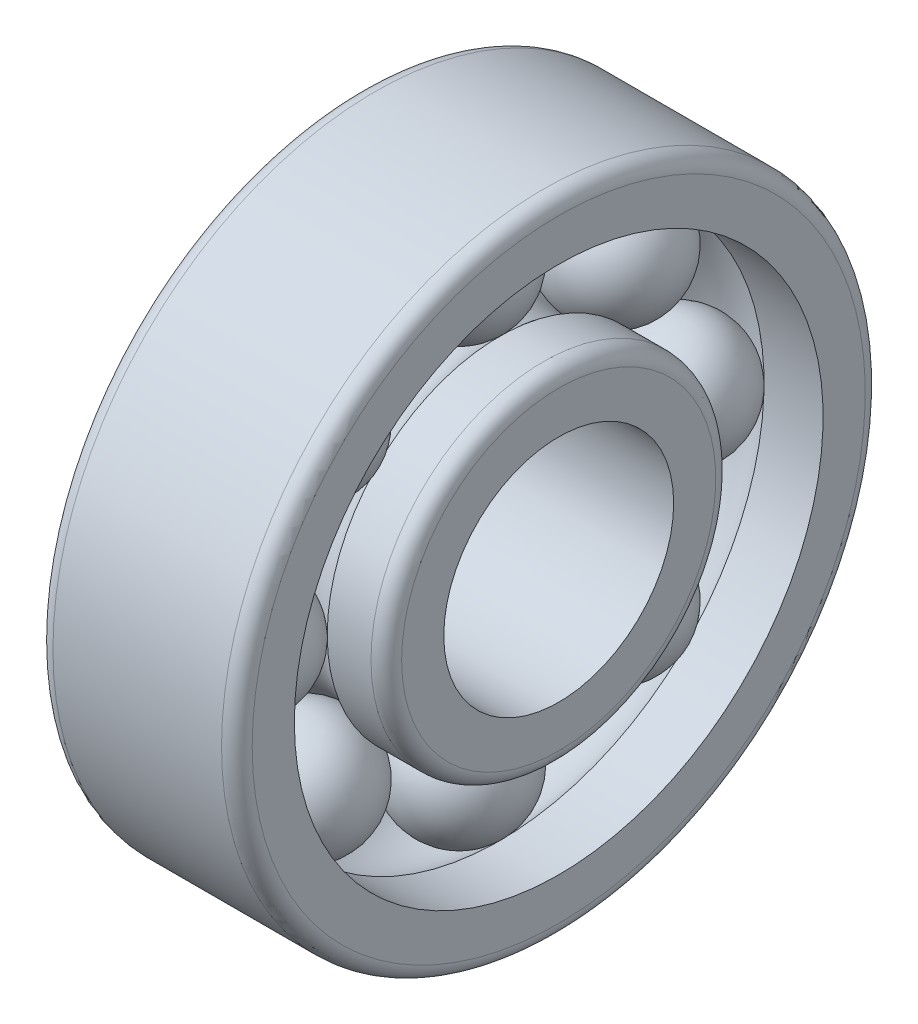
ISO-10303-21;
HEADER;
FILE_DESCRIPTION(('STEP AP214'),'2;1');
FILE_NAME('part.step','',(''),(''),'','','');
FILE_SCHEMA(('AUTOMOTIVE_DESIGN { 1 0 10303 214 1 1 1 1 }'));
ENDSEC;
DATA;
#1=APPLICATION_CONTEXT('core data for automotive mechanical design processes');
#2=APPLICATION_PROTOCOL_DEFINITION('international standard','automotive_design',2000,#1);
#3=PRODUCT_CONTEXT('',#1,'mechanical');
#4=PRODUCT('Part','Part','',(#3));
#5=PRODUCT_RELATED_PRODUCT_CATEGORY('part','',(#4));
#6=PRODUCT_DEFINITION_FORMATION('','',#4);
#7=PRODUCT_DEFINITION_CONTEXT('part definition',#1,'design');
#8=PRODUCT_DEFINITION('design','',#6,#7);
#9=PRODUCT_DEFINITION_SHAPE('','',#8);
#10=(LENGTH_UNIT() NAMED_UNIT(*) SI_UNIT(.MILLI.,.METRE.));
#11=(NAMED_UNIT(*) PLANE_ANGLE_UNIT() SI_UNIT($,.RADIAN.));
#12=(NAMED_UNIT(*) SI_UNIT($,.STERADIAN.) SOLID_ANGLE_UNIT());
#13=UNCERTAINTY_MEASURE_WITH_UNIT(LENGTH_MEASURE(1.E-05),#10,'distance_accuracy_value','');
#14=(GEOMETRIC_REPRESENTATION_CONTEXT(3) GLOBAL_UNCERTAINTY_ASSIGNED_CONTEXT((#13)) GLOBAL_UNIT_ASSIGNED_CONTEXT((#10,
#11,#12)) REPRESENTATION_CONTEXT('',''));
#15=CARTESIAN_POINT('',(0.,0.,0.));
#16=DIRECTION('',(0.,0.,1.));
#17=DIRECTION('',(1.,0.,0.));
#18=AXIS2_PLACEMENT_3D('',#15,#16,#17);
#19=CARTESIAN_POINT('',(0.,10.0762716319084,10.0762716319082));
#20=DIRECTION('',(0.,0.707106781186556,0.707106781186539));
#21=DIRECTION('',(0.,0.707106781186539,-0.707106781186556));
#22=AXIS2_PLACEMENT_3D('',#19,#20,#21);
#23=SPHERICAL_SURFACE('',#22,4.);
#24=CARTESIAN_POINT('',(0.,12.9046987566546,12.9046987566543));
#25=VERTEX_POINT('',#24);
#26=VERTEX_LOOP('',#25);
#27=FACE_BOUND('',#26,.T.);
#28=ADVANCED_FACE('F44',(#27),#23,.T.);
#29=CLOSED_SHELL('',(#28));
#30=MANIFOLD_SOLID_BREP('B2',#29);
#31=CARTESIAN_POINT('',(0.,1.49260827235544E-13,14.25));
#32=DIRECTION('',(0.,0.,1.));
#33=DIRECTION('',(0.,1.,0.));
#34=AXIS2_PLACEMENT_3D('',#31,#32,#33);
#35=SPHERICAL_SURFACE('',#34,4.);
#36=CARTESIAN_POINT('',(0.,1.91158603301662E-13,18.25));
#37=VERTEX_POINT('',#36);
#38=VERTEX_LOOP('',#37);
#39=FACE_BOUND('',#38,.T.);
#40=ADVANCED_FACE('F63',(#39),#35,.T.);
#41=CLOSED_SHELL('',(#40));
#42=MANIFOLD_SOLID_BREP('B6',#41);
#43=CARTESIAN_POINT('',(0.,-10.0762716319082,10.0762716319084));
#44=DIRECTION('',(0.,-0.707106781186541,0.707106781186554));
#45=DIRECTION('',(0.,0.707106781186554,0.707106781186541));
#46=AXIS2_PLACEMENT_3D('',#43,#44,#45);
#47=SPHERICAL_SURFACE('',#46,4.);
#48=CARTESIAN_POINT('',(0.,-12.9046987566544,12.9046987566546));
#49=VERTEX_POINT('',#48);
#50=VERTEX_LOOP('',#49);
#51=FACE_BOUND('',#50,.T.);
#52=ADVANCED_FACE('F82',(#51),#47,.T.);
#53=CLOSED_SHELL('',(#52));
#54=MANIFOLD_SOLID_BREP('B40',#53);
#55=CARTESIAN_POINT('',(0.,-14.25,0.));
#56=DIRECTION('',(0.,-1.,0.));
#57=DIRECTION('',(0.,0.,1.));
#58=AXIS2_PLACEMENT_3D('',#55,#56,#57);
#59=SPHERICAL_SURFACE('',#58,4.);
#60=CARTESIAN_POINT('',(0.,-18.25,0.));
#61=VERTEX_POINT('',#60);
#62=VERTEX_LOOP('',#61);
#63=FACE_BOUND('',#62,.T.);
#64=ADVANCED_FACE('F101',(#63),#59,.T.);
#65=CLOSED_SHELL('',(#64));
#66=MANIFOLD_SOLID_BREP('B59',#65);
#67=CARTESIAN_POINT('',(0.,-10.0762716319084,-10.0762716319082));
#68=DIRECTION('',(0.,-0.707106781186551,-0.707106781186544));
#69=DIRECTION('',(0.,-0.707106781186544,0.707106781186551));
#70=AXIS2_PLACEMENT_3D('',#67,#68,#69);
#71=SPHERICAL_SURFACE('',#70,4.);
#72=CARTESIAN_POINT('',(0.,-12.9046987566546,-12.9046987566544));
#73=VERTEX_POINT('',#72);
#74=VERTEX_LOOP('',#73);
#75=FACE_BOUND('',#74,.T.);
#76=ADVANCED_FACE('F120',(#75),#71,.T.);
#77=CLOSED_SHELL('',(#76));
#78=MANIFOLD_SOLID_BREP('B78',#77);
#79=CARTESIAN_POINT('',(0.,0.,-14.25));
#80=DIRECTION('',(0.,0.,-1.));
#81=DIRECTION('',(0.,-1.,0.));
#82=AXIS2_PLACEMENT_3D('',#79,#80,#81);
#83=SPHERICAL_SURFACE('',#82,4.);
#84=CARTESIAN_POINT('',(0.,0.,-18.25));
#85=VERTEX_POINT('',#84);
#86=VERTEX_LOOP('',#85);
#87=FACE_BOUND('',#86,.T.);
#88=ADVANCED_FACE('F139',(#87),#83,.T.);
#89=CLOSED_SHELL('',(#88));
#90=MANIFOLD_SOLID_BREP('B97',#89);
#91=CARTESIAN_POINT('',(0.,10.0762716319083,-10.0762716319083));
#92=DIRECTION('',(0.,0.707106781186546,-0.707106781186549));
#93=DIRECTION('',(0.,-0.707106781186549,-0.707106781186546));
#94=AXIS2_PLACEMENT_3D('',#91,#92,#93);
#95=SPHERICAL_SURFACE('',#94,4.);
#96=CARTESIAN_POINT('',(0.,12.9046987566545,-12.9046987566545));
#97=VERTEX_POINT('',#96);
#98=VERTEX_LOOP('',#97);
#99=FACE_BOUND('',#98,.T.);
#100=ADVANCED_FACE('F158',(#99),#95,.T.);
#101=CLOSED_SHELL('',(#100));
#102=MANIFOLD_SOLID_BREP('B116',#101);
#103=CARTESIAN_POINT('',(0.,14.25,0.));
#104=DIRECTION('',(0.,1.,0.));
#105=DIRECTION('',(0.,0.,-1.));
#106=AXIS2_PLACEMENT_3D('',#103,#104,#105);
#107=SPHERICAL_SURFACE('',#106,4.);
#108=CARTESIAN_POINT('',(0.,18.25,0.));
#109=VERTEX_POINT('',#108);
#110=VERTEX_LOOP('',#109);
#111=FACE_BOUND('',#110,.T.);
#112=ADVANCED_FACE('F179',(#111),#107,.T.);
#113=CLOSED_SHELL('',(#112));
#114=MANIFOLD_SOLID_BREP('B135',#113);
#115=CARTESIAN_POINT('',(0.,0.,0.));
#116=DIRECTION('',(-1.,0.,0.));
#117=DIRECTION('',(0.,0.,1.));
#118=AXIS2_PLACEMENT_3D('',#115,#116,#117);
#119=TOROIDAL_SURFACE('',#118,14.25,4.);
#120=CARTESIAN_POINT('',(2.64575131106459,0.,0.));
#121=DIRECTION('',(-1.,0.,0.));
#122=DIRECTION('',(0.,0.,1.));
#123=AXIS2_PLACEMENT_3D('',#120,#121,#122);
#124=CIRCLE('',#123,11.25);
#125=CARTESIAN_POINT('',(2.64575131106459,0.,11.25));
#126=VERTEX_POINT('',#125);
#127=EDGE_CURVE('E228',#126,#126,#124,.T.);
#128=ORIENTED_EDGE('',*,*,#127,.T.);
#129=EDGE_LOOP('',(#128));
#130=FACE_BOUND('',#129,.T.);
#131=CARTESIAN_POINT('',(-2.64575131106459,0.,0.));
#132=DIRECTION('',(-1.,0.,0.));
#133=DIRECTION('',(0.,0.,1.));
#134=AXIS2_PLACEMENT_3D('',#131,#132,#133);
#135=CIRCLE('',#134,11.25);
#136=CARTESIAN_POINT('',(-2.64575131106459,0.,11.25));
#137=VERTEX_POINT('',#136);
#138=EDGE_CURVE('E219',#137,#137,#135,.T.);
#139=ORIENTED_EDGE('',*,*,#138,.F.);
#140=EDGE_LOOP('',(#139));
#141=FACE_BOUND('',#140,.T.);
#142=ADVANCED_FACE('F199',(#130,#141),#119,.F.);
#143=CARTESIAN_POINT('',(0.,0.,0.));
#144=DIRECTION('',(-1.,0.,0.));
#145=DIRECTION('',(0.,0.,1.));
#146=AXIS2_PLACEMENT_3D('',#143,#144,#145);
#147=CYLINDRICAL_SURFACE('',#146,11.25);
#148=CARTESIAN_POINT('',(-5.5,0.,0.));
#149=DIRECTION('',(-1.,0.,0.));
#150=DIRECTION('',(0.,0.,1.));
#151=AXIS2_PLACEMENT_3D('',#148,#149,#150);
#152=CIRCLE('',#151,11.25);
#153=CARTESIAN_POINT('',(-5.5,0.,11.25));
#154=VERTEX_POINT('',#153);
#155=EDGE_CURVE('E210',#154,#154,#152,.F.);
#156=ORIENTED_EDGE('',*,*,#155,.T.);
#157=EDGE_LOOP('',(#156));
#158=FACE_BOUND('',#157,.T.);
#159=ORIENTED_EDGE('',*,*,#138,.T.);
#160=EDGE_LOOP('',(#159));
#161=FACE_BOUND('',#160,.T.);
#162=ADVANCED_FACE('F239',(#158,#161),#147,.T.);
#163=CARTESIAN_POINT('',(-6.5,0.,0.));
#164=DIRECTION('',(-1.,0.,0.));
#165=DIRECTION('',(0.,0.,1.));
#166=AXIS2_PLACEMENT_3D('',#163,#164,#165);
#167=PLANE('',#166);
#168=CARTESIAN_POINT('',(-6.5,0.,0.));
#169=DIRECTION('',(-1.,0.,0.));
#170=DIRECTION('',(0.,0.,1.));
#171=AXIS2_PLACEMENT_3D('',#168,#169,#170);
#172=CIRCLE('',#171,10.25);
#173=CARTESIAN_POINT('',(-6.5,0.,10.25));
#174=VERTEX_POINT('',#173);
#175=EDGE_CURVE('E214',#174,#174,#172,.T.);
#176=ORIENTED_EDGE('',*,*,#175,.T.);
#177=EDGE_LOOP('',(#176));
#178=FACE_BOUND('',#177,.T.);
#179=CARTESIAN_POINT('',(-6.5,0.,0.));
#180=DIRECTION('',(-1.,0.,0.));
#181=DIRECTION('',(0.,0.,1.));
#182=AXIS2_PLACEMENT_3D('',#179,#180,#181);
#183=CIRCLE('',#182,7.5);
#184=CARTESIAN_POINT('',(-6.5,0.,7.5));
#185=VERTEX_POINT('',#184);
#186=EDGE_CURVE('E222',#185,#185,#183,.T.);
#187=ORIENTED_EDGE('',*,*,#186,.F.);
#188=EDGE_LOOP('',(#187));
#189=FACE_BOUND('',#188,.T.);
#190=ADVANCED_FACE('F248',(#178,#189),#167,.T.);
#191=CARTESIAN_POINT('',(0.,0.,0.));
#192=DIRECTION('',(-1.,0.,0.));
#193=DIRECTION('',(0.,0.,1.));
#194=AXIS2_PLACEMENT_3D('',#191,#192,#193);
#195=CYLINDRICAL_SURFACE('',#194,7.5);
#196=CARTESIAN_POINT('',(6.5,0.,0.));
#197=DIRECTION('',(-1.,0.,0.));
#198=DIRECTION('',(0.,0.,1.));
#199=AXIS2_PLACEMENT_3D('',#196,#197,#198);
#200=CIRCLE('',#199,7.5);
#201=CARTESIAN_POINT('',(6.5,0.,7.5));
#202=VERTEX_POINT('',#201);
#203=EDGE_CURVE('E225',#202,#202,#200,.T.);
#204=ORIENTED_EDGE('',*,*,#203,.F.);
#205=EDGE_LOOP('',(#204));
#206=FACE_BOUND('',#205,.T.);
#207=ORIENTED_EDGE('',*,*,#186,.T.);
#208=EDGE_LOOP('',(#207));
#209=FACE_BOUND('',#208,.T.);
#210=ADVANCED_FACE('F245',(#206,#209),#195,.F.);
#211=CARTESIAN_POINT('',(6.5,0.,0.));
#212=DIRECTION('',(-1.,0.,0.));
#213=DIRECTION('',(0.,0.,1.));
#214=AXIS2_PLACEMENT_3D('',#211,#212,#213);
#215=PLANE('',#214);
#216=CARTESIAN_POINT('',(6.5,0.,0.));
#217=DIRECTION('',(-1.,0.,0.));
#218=DIRECTION('',(0.,0.,1.));
#219=AXIS2_PLACEMENT_3D('',#216,#217,#218);
#220=CIRCLE('',#219,10.25);
#221=CARTESIAN_POINT('',(6.5,0.,10.25));
#222=VERTEX_POINT('',#221);
#223=EDGE_CURVE('E178',#222,#222,#220,.F.);
#224=ORIENTED_EDGE('',*,*,#223,.T.);
#225=EDGE_LOOP('',(#224));
#226=FACE_BOUND('',#225,.T.);
#227=ORIENTED_EDGE('',*,*,#203,.T.);
#228=EDGE_LOOP('',(#227));
#229=FACE_BOUND('',#228,.T.);
#230=ADVANCED_FACE('F237',(#226,#229),#215,.F.);
#231=CARTESIAN_POINT('',(5.5,0.,0.));
#232=DIRECTION('',(-1.,0.,0.));
#233=DIRECTION('',(0.,0.,1.));
#234=AXIS2_PLACEMENT_3D('',#231,#232,#233);
#235=CIRCLE('',#234,11.25);
#236=CARTESIAN_POINT('',(5.5,0.,11.25));
#237=VERTEX_POINT('',#236);
#238=EDGE_CURVE('E206',#237,#237,#235,.T.);
#239=ORIENTED_EDGE('',*,*,#238,.T.);
#240=EDGE_LOOP('',(#239));
#241=FACE_BOUND('',#240,.T.);
#242=ORIENTED_EDGE('',*,*,#127,.F.);
#243=EDGE_LOOP('',(#242));
#244=FACE_BOUND('',#243,.T.);
#245=ADVANCED_FACE('F234',(#241,#244),#147,.T.);
#246=CARTESIAN_POINT('',(-5.5,0.,0.));
#247=DIRECTION('',(-1.,0.,0.));
#248=DIRECTION('',(0.,0.,1.));
#249=AXIS2_PLACEMENT_3D('',#246,#247,#248);
#250=TOROIDAL_SURFACE('',#249,10.25,1.);
#251=ORIENTED_EDGE('',*,*,#155,.F.);
#252=EDGE_LOOP('',(#251));
#253=FACE_BOUND('',#252,.T.);
#254=ORIENTED_EDGE('',*,*,#175,.F.);
#255=EDGE_LOOP('',(#254));
#256=FACE_BOUND('',#255,.T.);
#257=ADVANCED_FACE('F236',(#253,#256),#250,.T.);
#258=CARTESIAN_POINT('',(5.5,0.,0.));
#259=DIRECTION('',(-1.,0.,0.));
#260=DIRECTION('',(0.,0.,1.));
#261=AXIS2_PLACEMENT_3D('',#258,#259,#260);
#262=TOROIDAL_SURFACE('',#261,10.25,1.);
#263=ORIENTED_EDGE('',*,*,#223,.F.);
#264=EDGE_LOOP('',(#263));
#265=FACE_BOUND('',#264,.T.);
#266=ORIENTED_EDGE('',*,*,#238,.F.);
#267=EDGE_LOOP('',(#266));
#268=FACE_BOUND('',#267,.T.);
#269=ADVANCED_FACE('F201',(#265,#268),#262,.T.);
#270=CLOSED_SHELL('',(#142,#162,#190,#210,#230,#245,#257,#269));
#271=MANIFOLD_SOLID_BREP('B154',#270);
#272=CARTESIAN_POINT('',(0.,0.,0.));
#273=DIRECTION('',(-1.,0.,0.));
#274=DIRECTION('',(0.,0.,1.));
#275=AXIS2_PLACEMENT_3D('',#272,#273,#274);
#276=TOROIDAL_SURFACE('',#275,14.25,4.);
#277=CARTESIAN_POINT('',(-2.64575131106459,0.,0.));
#278=DIRECTION('',(-1.,0.,0.));
#279=DIRECTION('',(0.,0.,1.));
#280=AXIS2_PLACEMENT_3D('',#277,#278,#279);
#281=CIRCLE('',#280,17.25);
#282=CARTESIAN_POINT('',(-2.64575131106459,0.,17.25));
#283=VERTEX_POINT('',#282);
#284=EDGE_CURVE('E356',#283,#283,#281,.T.);
#285=ORIENTED_EDGE('',*,*,#284,.T.);
#286=EDGE_LOOP('',(#285));
#287=FACE_BOUND('',#286,.T.);
#288=CARTESIAN_POINT('',(2.64575131106459,0.,0.));
#289=DIRECTION('',(-1.,0.,0.));
#290=DIRECTION('',(0.,0.,1.));
#291=AXIS2_PLACEMENT_3D('',#288,#289,#290);
#292=CIRCLE('',#291,17.25);
#293=CARTESIAN_POINT('',(2.64575131106459,0.,17.25));
#294=VERTEX_POINT('',#293);
#295=EDGE_CURVE('E344',#294,#294,#292,.T.);
#296=ORIENTED_EDGE('',*,*,#295,.F.);
#297=EDGE_LOOP('',(#296));
#298=FACE_BOUND('',#297,.T.);
#299=ADVANCED_FACE('F320',(#287,#298),#276,.F.);
#300=CARTESIAN_POINT('',(0.,0.,0.));
#301=DIRECTION('',(-1.,0.,0.));
#302=DIRECTION('',(0.,0.,1.));
#303=AXIS2_PLACEMENT_3D('',#300,#301,#302);
#304=CYLINDRICAL_SURFACE('',#303,17.25);
#305=CARTESIAN_POINT('',(6.5,0.,0.));
#306=DIRECTION('',(-1.,0.,0.));
#307=DIRECTION('',(0.,0.,1.));
#308=AXIS2_PLACEMENT_3D('',#305,#306,#307);
#309=CIRCLE('',#308,17.25);
#310=CARTESIAN_POINT('',(6.5,0.,17.25));
#311=VERTEX_POINT('',#310);
#312=EDGE_CURVE('E348',#311,#311,#309,.T.);
#313=ORIENTED_EDGE('',*,*,#312,.F.);
#314=EDGE_LOOP('',(#313));
#315=FACE_BOUND('',#314,.T.);
#316=ORIENTED_EDGE('',*,*,#295,.T.);
#317=EDGE_LOOP('',(#316));
#318=FACE_BOUND('',#317,.T.);
#319=ADVANCED_FACE('F369',(#315,#318),#304,.F.);
#320=CARTESIAN_POINT('',(6.5,0.,0.));
#321=DIRECTION('',(-1.,0.,0.));
#322=DIRECTION('',(0.,0.,1.));
#323=AXIS2_PLACEMENT_3D('',#320,#321,#322);
#324=PLANE('',#323);
#325=CARTESIAN_POINT('',(6.5,0.,0.));
#326=DIRECTION('',(-1.,0.,0.));
#327=DIRECTION('',(0.,0.,1.));
#328=AXIS2_PLACEMENT_3D('',#325,#326,#327);
#329=CIRCLE('',#328,20.);
#330=CARTESIAN_POINT('',(6.5,0.,20.));
#331=VERTEX_POINT('',#330);
#332=EDGE_CURVE('E198',#331,#331,#329,.F.);
#333=ORIENTED_EDGE('',*,*,#332,.T.);
#334=EDGE_LOOP('',(#333));
#335=FACE_BOUND('',#334,.T.);
#336=ORIENTED_EDGE('',*,*,#312,.T.);
#337=EDGE_LOOP('',(#336));
#338=FACE_BOUND('',#337,.T.);
#339=ADVANCED_FACE('F379',(#335,#338),#324,.F.);
#340=CARTESIAN_POINT('',(0.,0.,0.));
#341=DIRECTION('',(-1.,0.,0.));
#342=DIRECTION('',(0.,0.,1.));
#343=AXIS2_PLACEMENT_3D('',#340,#341,#342);
#344=CYLINDRICAL_SURFACE('',#343,21.);
#345=CARTESIAN_POINT('',(-5.5,0.,0.));
#346=DIRECTION('',(-1.,0.,0.));
#347=DIRECTION('',(0.,0.,1.));
#348=AXIS2_PLACEMENT_3D('',#345,#346,#347);
#349=CIRCLE('',#348,21.);
#350=CARTESIAN_POINT('',(-5.5,0.,21.));
#351=VERTEX_POINT('',#350);
#352=EDGE_CURVE('E328',#351,#351,#349,.F.);
#353=ORIENTED_EDGE('',*,*,#352,.T.);
#354=EDGE_LOOP('',(#353));
#355=FACE_BOUND('',#354,.T.);
#356=CARTESIAN_POINT('',(5.5,0.,0.));
#357=DIRECTION('',(-1.,0.,0.));
#358=DIRECTION('',(0.,0.,1.));
#359=AXIS2_PLACEMENT_3D('',#356,#357,#358);
#360=CIRCLE('',#359,21.);
#361=CARTESIAN_POINT('',(5.5,0.,21.));
#362=VERTEX_POINT('',#361);
#363=EDGE_CURVE('E333',#362,#362,#360,.T.);
#364=ORIENTED_EDGE('',*,*,#363,.T.);
#365=EDGE_LOOP('',(#364));
#366=FACE_BOUND('',#365,.T.);
#367=ADVANCED_FACE('F373',(#355,#366),#344,.T.);
#368=CARTESIAN_POINT('',(-6.5,0.,0.));
#369=DIRECTION('',(-1.,0.,0.));
#370=DIRECTION('',(0.,0.,1.));
#371=AXIS2_PLACEMENT_3D('',#368,#369,#370);
#372=PLANE('',#371);
#373=CARTESIAN_POINT('',(-6.5,0.,0.));
#374=DIRECTION('',(-1.,0.,0.));
#375=DIRECTION('',(0.,0.,1.));
#376=AXIS2_PLACEMENT_3D('',#373,#374,#375);
#377=CIRCLE('',#376,20.);
#378=CARTESIAN_POINT('',(-6.5,0.,20.));
#379=VERTEX_POINT('',#378);
#380=EDGE_CURVE('E338',#379,#379,#377,.T.);
#381=ORIENTED_EDGE('',*,*,#380,.T.);
#382=EDGE_LOOP('',(#381));
#383=FACE_BOUND('',#382,.T.);
#384=CARTESIAN_POINT('',(-6.5,0.,0.));
#385=DIRECTION('',(-1.,0.,0.));
#386=DIRECTION('',(0.,0.,1.));
#387=AXIS2_PLACEMENT_3D('',#384,#385,#386);
#388=CIRCLE('',#387,17.25);
#389=CARTESIAN_POINT('',(-6.5,0.,17.25));
#390=VERTEX_POINT('',#389);
#391=EDGE_CURVE('E352',#390,#390,#388,.T.);
#392=ORIENTED_EDGE('',*,*,#391,.F.);
#393=EDGE_LOOP('',(#392));
#394=FACE_BOUND('',#393,.T.);
#395=ADVANCED_FACE('F367',(#383,#394),#372,.T.);
#396=ORIENTED_EDGE('',*,*,#284,.F.);
#397=EDGE_LOOP('',(#396));
#398=FACE_BOUND('',#397,.T.);
#399=ORIENTED_EDGE('',*,*,#391,.T.);
#400=EDGE_LOOP('',(#399));
#401=FACE_BOUND('',#400,.T.);
#402=ADVANCED_FACE('F363',(#398,#401),#304,.F.);
#403=CARTESIAN_POINT('',(-5.5,0.,0.));
#404=DIRECTION('',(-1.,0.,0.));
#405=DIRECTION('',(0.,0.,1.));
#406=AXIS2_PLACEMENT_3D('',#403,#404,#405);
#407=TOROIDAL_SURFACE('',#406,20.,1.);
#408=ORIENTED_EDGE('',*,*,#352,.F.);
#409=EDGE_LOOP('',(#408));
#410=FACE_BOUND('',#409,.T.);
#411=ORIENTED_EDGE('',*,*,#380,.F.);
#412=EDGE_LOOP('',(#411));
#413=FACE_BOUND('',#412,.T.);
#414=ADVANCED_FACE('F366',(#410,#413),#407,.T.);
#415=CARTESIAN_POINT('',(5.5,0.,0.));
#416=DIRECTION('',(-1.,0.,0.));
#417=DIRECTION('',(0.,0.,1.));
#418=AXIS2_PLACEMENT_3D('',#415,#416,#417);
#419=TOROIDAL_SURFACE('',#418,20.,1.);
#420=ORIENTED_EDGE('',*,*,#332,.F.);
#421=EDGE_LOOP('',(#420));
#422=FACE_BOUND('',#421,.T.);
#423=ORIENTED_EDGE('',*,*,#363,.F.);
#424=EDGE_LOOP('',(#423));
#425=FACE_BOUND('',#424,.T.);
#426=ADVANCED_FACE('F322',(#422,#425),#419,.T.);
#427=CLOSED_SHELL('',(#299,#319,#339,#367,#395,#402,#414,#426));
#428=MANIFOLD_SOLID_BREP('B173',#427);
#429=ADVANCED_BREP_SHAPE_REPRESENTATION('',(#18,#30,#42,#54,#66,#78,#90,#102,#114,#271,#428),#14);
#430=SHAPE_DEFINITION_REPRESENTATION(#9,#429);
ENDSEC;
END-ISO-10303-21;
